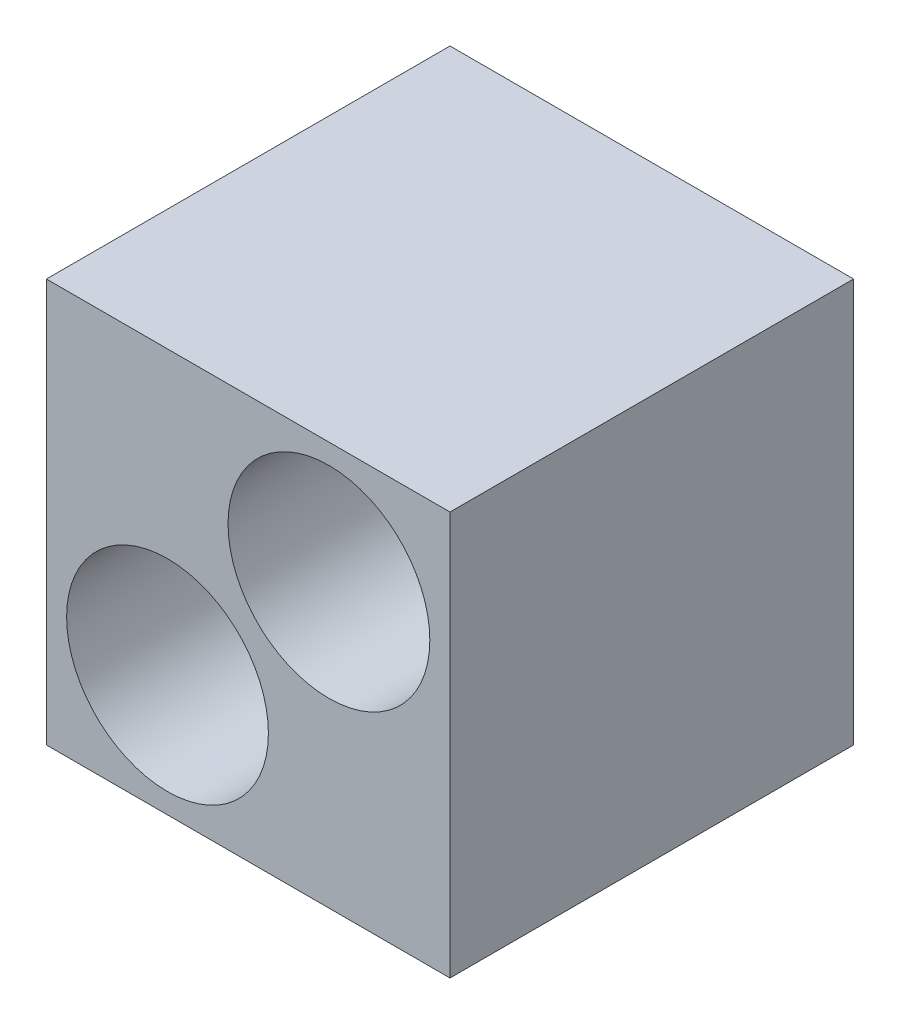
ISO-10303-21;
HEADER;
FILE_DESCRIPTION(('STEP AP214'),'2;1');
FILE_NAME('part.step','',(''),(''),'','','');
FILE_SCHEMA(('AUTOMOTIVE_DESIGN { 1 0 10303 214 1 1 1 1 }'));
ENDSEC;
DATA;
#1=APPLICATION_CONTEXT('core data for automotive mechanical design processes');
#2=APPLICATION_PROTOCOL_DEFINITION('international standard','automotive_design',2000,#1);
#3=PRODUCT_CONTEXT('',#1,'mechanical');
#4=PRODUCT('Part','Part','',(#3));
#5=PRODUCT_RELATED_PRODUCT_CATEGORY('part','',(#4));
#6=PRODUCT_DEFINITION_FORMATION('','',#4);
#7=PRODUCT_DEFINITION_CONTEXT('part definition',#1,'design');
#8=PRODUCT_DEFINITION('design','',#6,#7);
#9=PRODUCT_DEFINITION_SHAPE('','',#8);
#10=(LENGTH_UNIT() NAMED_UNIT(*) SI_UNIT(.MILLI.,.METRE.));
#11=(NAMED_UNIT(*) PLANE_ANGLE_UNIT() SI_UNIT($,.RADIAN.));
#12=(NAMED_UNIT(*) SI_UNIT($,.STERADIAN.) SOLID_ANGLE_UNIT());
#13=UNCERTAINTY_MEASURE_WITH_UNIT(LENGTH_MEASURE(1.E-05),#10,'distance_accuracy_value','');
#14=(GEOMETRIC_REPRESENTATION_CONTEXT(3) GLOBAL_UNCERTAINTY_ASSIGNED_CONTEXT((#13)) GLOBAL_UNIT_ASSIGNED_CONTEXT((#10,
#11,#12)) REPRESENTATION_CONTEXT('',''));
#15=CARTESIAN_POINT('',(0.,0.,0.));
#16=DIRECTION('',(0.,0.,1.));
#17=DIRECTION('',(1.,0.,0.));
#18=AXIS2_PLACEMENT_3D('',#15,#16,#17);
#19=CARTESIAN_POINT('',(0.,0.,10.));
#20=DIRECTION('',(1.,0.,0.));
#21=DIRECTION('',(0.,0.,-1.));
#22=AXIS2_PLACEMENT_3D('',#19,#20,#21);
#23=PLANE('',#22);
#24=DIRECTION('',(0.,-1.,0.));
#25=VECTOR('',#24,1.);
#26=CARTESIAN_POINT('',(0.,0.,0.));
#27=LINE('',#26,#25);
#28=CARTESIAN_POINT('',(0.,10.,0.));
#29=VERTEX_POINT('',#28);
#30=CARTESIAN_POINT('',(0.,0.,0.));
#31=VERTEX_POINT('',#30);
#32=EDGE_CURVE('E98',#29,#31,#27,.T.);
#33=ORIENTED_EDGE('',*,*,#32,.T.);
#34=DIRECTION('',(0.,0.,-1.));
#35=VECTOR('',#34,1.);
#36=CARTESIAN_POINT('',(0.,0.,10.));
#37=LINE('',#36,#35);
#38=CARTESIAN_POINT('',(0.,0.,10.));
#39=VERTEX_POINT('',#38);
#40=EDGE_CURVE('E11',#39,#31,#37,.T.);
#41=ORIENTED_EDGE('',*,*,#40,.F.);
#42=DIRECTION('',(0.,-1.,0.));
#43=VECTOR('',#42,1.);
#44=CARTESIAN_POINT('',(0.,0.,10.));
#45=LINE('',#44,#43);
#46=CARTESIAN_POINT('',(0.,10.,10.));
#47=VERTEX_POINT('',#46);
#48=EDGE_CURVE('E86',#47,#39,#45,.T.);
#49=ORIENTED_EDGE('',*,*,#48,.F.);
#50=DIRECTION('',(0.,0.,-1.));
#51=VECTOR('',#50,1.);
#52=CARTESIAN_POINT('',(0.,10.,10.));
#53=LINE('',#52,#51);
#54=EDGE_CURVE('E94',#47,#29,#53,.T.);
#55=ORIENTED_EDGE('',*,*,#54,.T.);
#56=EDGE_LOOP('',(#33,#41,#49,#55));
#57=FACE_BOUND('',#56,.T.);
#58=ADVANCED_FACE('F35',(#57),#23,.F.);
#59=CARTESIAN_POINT('',(0.,0.,10.));
#60=DIRECTION('',(0.,1.,0.));
#61=DIRECTION('',(0.,0.,1.));
#62=AXIS2_PLACEMENT_3D('',#59,#60,#61);
#63=PLANE('',#62);
#64=DIRECTION('',(1.,0.,0.));
#65=VECTOR('',#64,1.);
#66=CARTESIAN_POINT('',(0.,0.,0.));
#67=LINE('',#66,#65);
#68=CARTESIAN_POINT('',(10.,0.,0.));
#69=VERTEX_POINT('',#68);
#70=EDGE_CURVE('E90',#31,#69,#67,.T.);
#71=ORIENTED_EDGE('',*,*,#70,.T.);
#72=DIRECTION('',(0.,0.,-1.));
#73=VECTOR('',#72,1.);
#74=CARTESIAN_POINT('',(10.,0.,10.));
#75=LINE('',#74,#73);
#76=CARTESIAN_POINT('',(10.,0.,10.));
#77=VERTEX_POINT('',#76);
#78=EDGE_CURVE('E43',#77,#69,#75,.T.);
#79=ORIENTED_EDGE('',*,*,#78,.F.);
#80=DIRECTION('',(1.,0.,0.));
#81=VECTOR('',#80,1.);
#82=CARTESIAN_POINT('',(0.,0.,10.));
#83=LINE('',#82,#81);
#84=EDGE_CURVE('E81',#39,#77,#83,.T.);
#85=ORIENTED_EDGE('',*,*,#84,.F.);
#86=ORIENTED_EDGE('',*,*,#40,.T.);
#87=EDGE_LOOP('',(#71,#79,#85,#86));
#88=FACE_BOUND('',#87,.T.);
#89=ADVANCED_FACE('F89',(#88),#63,.F.);
#90=CARTESIAN_POINT('',(10.,0.,10.));
#91=DIRECTION('',(-1.,0.,0.));
#92=DIRECTION('',(0.,0.,1.));
#93=AXIS2_PLACEMENT_3D('',#90,#91,#92);
#94=PLANE('',#93);
#95=DIRECTION('',(0.,1.,0.));
#96=VECTOR('',#95,1.);
#97=CARTESIAN_POINT('',(10.,0.,0.));
#98=LINE('',#97,#96);
#99=CARTESIAN_POINT('',(10.,10.,0.));
#100=VERTEX_POINT('',#99);
#101=EDGE_CURVE('E68',#69,#100,#98,.T.);
#102=ORIENTED_EDGE('',*,*,#101,.T.);
#103=DIRECTION('',(0.,0.,-1.));
#104=VECTOR('',#103,1.);
#105=CARTESIAN_POINT('',(10.,10.,10.));
#106=LINE('',#105,#104);
#107=CARTESIAN_POINT('',(10.,10.,10.));
#108=VERTEX_POINT('',#107);
#109=EDGE_CURVE('E91',#108,#100,#106,.T.);
#110=ORIENTED_EDGE('',*,*,#109,.F.);
#111=DIRECTION('',(0.,1.,0.));
#112=VECTOR('',#111,1.);
#113=CARTESIAN_POINT('',(10.,0.,10.));
#114=LINE('',#113,#112);
#115=EDGE_CURVE('E84',#77,#108,#114,.T.);
#116=ORIENTED_EDGE('',*,*,#115,.F.);
#117=ORIENTED_EDGE('',*,*,#78,.T.);
#118=EDGE_LOOP('',(#102,#110,#116,#117));
#119=FACE_BOUND('',#118,.T.);
#120=ADVANCED_FACE('F92',(#119),#94,.F.);
#121=CARTESIAN_POINT('',(0.,10.,10.));
#122=DIRECTION('',(0.,-1.,0.));
#123=DIRECTION('',(0.,0.,-1.));
#124=AXIS2_PLACEMENT_3D('',#121,#122,#123);
#125=PLANE('',#124);
#126=DIRECTION('',(-1.,0.,0.));
#127=VECTOR('',#126,1.);
#128=CARTESIAN_POINT('',(0.,10.,0.));
#129=LINE('',#128,#127);
#130=EDGE_CURVE('E74',#100,#29,#129,.T.);
#131=ORIENTED_EDGE('',*,*,#130,.T.);
#132=ORIENTED_EDGE('',*,*,#54,.F.);
#133=DIRECTION('',(-1.,0.,0.));
#134=VECTOR('',#133,1.);
#135=CARTESIAN_POINT('',(0.,10.,10.));
#136=LINE('',#135,#134);
#137=EDGE_CURVE('E51',#108,#47,#136,.T.);
#138=ORIENTED_EDGE('',*,*,#137,.F.);
#139=ORIENTED_EDGE('',*,*,#109,.T.);
#140=EDGE_LOOP('',(#131,#132,#138,#139));
#141=FACE_BOUND('',#140,.T.);
#142=ADVANCED_FACE('F106',(#141),#125,.F.);
#143=CARTESIAN_POINT('',(0.,0.,10.));
#144=DIRECTION('',(0.,0.,-1.));
#145=DIRECTION('',(-1.,0.,0.));
#146=AXIS2_PLACEMENT_3D('',#143,#144,#145);
#147=PLANE('',#146);
#148=CARTESIAN_POINT('',(7.,7.,10.));
#149=DIRECTION('',(0.,0.,1.));
#150=DIRECTION('',(1.,0.,0.));
#151=AXIS2_PLACEMENT_3D('',#148,#149,#150);
#152=CIRCLE('',#151,2.5);
#153=CARTESIAN_POINT('',(9.5,7.,10.));
#154=VERTEX_POINT('',#153);
#155=EDGE_CURVE('E118',#154,#154,#152,.T.);
#156=ORIENTED_EDGE('',*,*,#155,.F.);
#157=EDGE_LOOP('',(#156));
#158=FACE_BOUND('',#157,.T.);
#159=CARTESIAN_POINT('',(3.,3.,10.));
#160=DIRECTION('',(0.,0.,1.));
#161=DIRECTION('',(1.,0.,0.));
#162=AXIS2_PLACEMENT_3D('',#159,#160,#161);
#163=CIRCLE('',#162,2.5);
#164=CARTESIAN_POINT('',(5.5,3.,10.));
#165=VERTEX_POINT('',#164);
#166=EDGE_CURVE('E112',#165,#165,#163,.T.);
#167=ORIENTED_EDGE('',*,*,#166,.F.);
#168=EDGE_LOOP('',(#167));
#169=FACE_BOUND('',#168,.T.);
#170=ORIENTED_EDGE('',*,*,#48,.T.);
#171=ORIENTED_EDGE('',*,*,#84,.T.);
#172=ORIENTED_EDGE('',*,*,#115,.T.);
#173=ORIENTED_EDGE('',*,*,#137,.T.);
#174=EDGE_LOOP('',(#170,#171,#172,#173));
#175=FACE_BOUND('',#174,.T.);
#176=ADVANCED_FACE('F82',(#158,#169,#175),#147,.F.);
#177=CARTESIAN_POINT('',(0.,0.,0.));
#178=DIRECTION('',(0.,0.,-1.));
#179=DIRECTION('',(-1.,0.,0.));
#180=AXIS2_PLACEMENT_3D('',#177,#178,#179);
#181=PLANE('',#180);
#182=CARTESIAN_POINT('',(7.,7.,0.));
#183=DIRECTION('',(0.,0.,1.));
#184=DIRECTION('',(1.,0.,0.));
#185=AXIS2_PLACEMENT_3D('',#182,#183,#184);
#186=CIRCLE('',#185,2.5);
#187=CARTESIAN_POINT('',(9.5,7.,0.));
#188=VERTEX_POINT('',#187);
#189=EDGE_CURVE('E115',#188,#188,#186,.T.);
#190=ORIENTED_EDGE('',*,*,#189,.T.);
#191=EDGE_LOOP('',(#190));
#192=FACE_BOUND('',#191,.T.);
#193=CARTESIAN_POINT('',(3.,3.,0.));
#194=DIRECTION('',(0.,0.,1.));
#195=DIRECTION('',(1.,0.,0.));
#196=AXIS2_PLACEMENT_3D('',#193,#194,#195);
#197=CIRCLE('',#196,2.5);
#198=CARTESIAN_POINT('',(5.5,3.,0.));
#199=VERTEX_POINT('',#198);
#200=EDGE_CURVE('E101',#199,#199,#197,.T.);
#201=ORIENTED_EDGE('',*,*,#200,.T.);
#202=EDGE_LOOP('',(#201));
#203=FACE_BOUND('',#202,.T.);
#204=ORIENTED_EDGE('',*,*,#32,.F.);
#205=ORIENTED_EDGE('',*,*,#130,.F.);
#206=ORIENTED_EDGE('',*,*,#101,.F.);
#207=ORIENTED_EDGE('',*,*,#70,.F.);
#208=EDGE_LOOP('',(#204,#205,#206,#207));
#209=FACE_BOUND('',#208,.T.);
#210=ADVANCED_FACE('F109',(#192,#203,#209),#181,.T.);
#211=CARTESIAN_POINT('',(3.,3.,0.));
#212=DIRECTION('',(0.,0.,1.));
#213=DIRECTION('',(1.,0.,0.));
#214=AXIS2_PLACEMENT_3D('',#211,#212,#213);
#215=CYLINDRICAL_SURFACE('',#214,2.5);
#216=ORIENTED_EDGE('',*,*,#200,.F.);
#217=EDGE_LOOP('',(#216));
#218=FACE_BOUND('',#217,.T.);
#219=ORIENTED_EDGE('',*,*,#166,.T.);
#220=EDGE_LOOP('',(#219));
#221=FACE_BOUND('',#220,.T.);
#222=ADVANCED_FACE('F129',(#218,#221),#215,.F.);
#223=CARTESIAN_POINT('',(7.,7.,0.));
#224=DIRECTION('',(0.,0.,1.));
#225=DIRECTION('',(1.,0.,0.));
#226=AXIS2_PLACEMENT_3D('',#223,#224,#225);
#227=CYLINDRICAL_SURFACE('',#226,2.5);
#228=ORIENTED_EDGE('',*,*,#189,.F.);
#229=EDGE_LOOP('',(#228));
#230=FACE_BOUND('',#229,.T.);
#231=ORIENTED_EDGE('',*,*,#155,.T.);
#232=EDGE_LOOP('',(#231));
#233=FACE_BOUND('',#232,.T.);
#234=ADVANCED_FACE('F126',(#230,#233),#227,.F.);
#235=CLOSED_SHELL('',(#58,#89,#120,#142,#176,#210,#222,#234));
#236=MANIFOLD_SOLID_BREP('B2',#235);
#237=ADVANCED_BREP_SHAPE_REPRESENTATION('',(#18,#236),#14);
#238=SHAPE_DEFINITION_REPRESENTATION(#9,#237);
ENDSEC;
END-ISO-10303-21;
